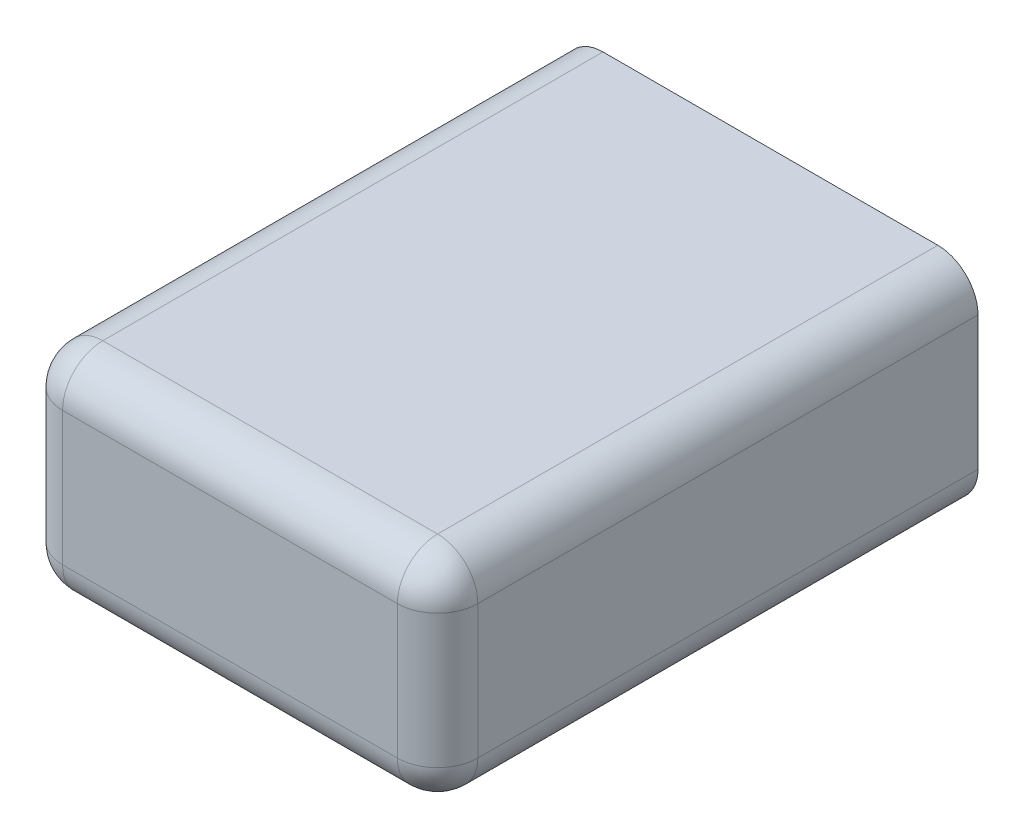
ISO-10303-21;
HEADER;
FILE_DESCRIPTION(('STEP AP214'),'2;1');
FILE_NAME('part.step','',(''),(''),'','','');
FILE_SCHEMA(('AUTOMOTIVE_DESIGN { 1 0 10303 214 1 1 1 1 }'));
ENDSEC;
DATA;
#1=APPLICATION_CONTEXT('core data for automotive mechanical design processes');
#2=APPLICATION_PROTOCOL_DEFINITION('international standard','automotive_design',2000,#1);
#3=PRODUCT_CONTEXT('',#1,'mechanical');
#4=PRODUCT('Part','Part','',(#3));
#5=PRODUCT_RELATED_PRODUCT_CATEGORY('part','',(#4));
#6=PRODUCT_DEFINITION_FORMATION('','',#4);
#7=PRODUCT_DEFINITION_CONTEXT('part definition',#1,'design');
#8=PRODUCT_DEFINITION('design','',#6,#7);
#9=PRODUCT_DEFINITION_SHAPE('','',#8);
#10=(LENGTH_UNIT() NAMED_UNIT(*) SI_UNIT(.MILLI.,.METRE.));
#11=(NAMED_UNIT(*) PLANE_ANGLE_UNIT() SI_UNIT($,.RADIAN.));
#12=(NAMED_UNIT(*) SI_UNIT($,.STERADIAN.) SOLID_ANGLE_UNIT());
#13=UNCERTAINTY_MEASURE_WITH_UNIT(LENGTH_MEASURE(1.E-05),#10,'distance_accuracy_value','');
#14=(GEOMETRIC_REPRESENTATION_CONTEXT(3) GLOBAL_UNCERTAINTY_ASSIGNED_CONTEXT((#13)) GLOBAL_UNIT_ASSIGNED_CONTEXT((#10,
#11,#12)) REPRESENTATION_CONTEXT('',''));
#15=CARTESIAN_POINT('',(0.,0.,0.));
#16=DIRECTION('',(0.,0.,1.));
#17=DIRECTION('',(1.,0.,0.));
#18=AXIS2_PLACEMENT_3D('',#15,#16,#17);
#19=CARTESIAN_POINT('',(0.,0.,0.));
#20=DIRECTION('',(0.,0.,1.));
#21=DIRECTION('',(1.,0.,0.));
#22=AXIS2_PLACEMENT_3D('',#19,#20,#21);
#23=PLANE('',#22);
#24=DIRECTION('',(1.,0.,0.));
#25=VECTOR('',#24,1.);
#26=CARTESIAN_POINT('',(7.,-4.26,0.));
#27=LINE('',#26,#25);
#28=CARTESIAN_POINT('',(-6.66,-4.26,0.));
#29=VERTEX_POINT('',#28);
#30=CARTESIAN_POINT('',(6.66,-4.26,0.));
#31=VERTEX_POINT('',#30);
#32=EDGE_CURVE('E211',#29,#31,#27,.T.);
#33=ORIENTED_EDGE('',*,*,#32,.F.);
#34=CARTESIAN_POINT('',(-6.66,-2.66,0.));
#35=DIRECTION('',(0.,0.,1.));
#36=DIRECTION('',(1.,0.,0.));
#37=AXIS2_PLACEMENT_3D('',#34,#35,#36);
#38=CIRCLE('',#37,1.6);
#39=CARTESIAN_POINT('',(-8.26,-2.66,0.));
#40=VERTEX_POINT('',#39);
#41=EDGE_CURVE('E195',#29,#40,#38,.F.);
#42=ORIENTED_EDGE('',*,*,#41,.T.);
#43=DIRECTION('',(0.,-1.,0.));
#44=VECTOR('',#43,1.);
#45=CARTESIAN_POINT('',(-8.26,-3.,0.));
#46=LINE('',#45,#44);
#47=CARTESIAN_POINT('',(-8.26,2.66,0.));
#48=VERTEX_POINT('',#47);
#49=EDGE_CURVE('E224',#48,#40,#46,.T.);
#50=ORIENTED_EDGE('',*,*,#49,.F.);
#51=CARTESIAN_POINT('',(-6.66,2.66,0.));
#52=DIRECTION('',(0.,0.,1.));
#53=DIRECTION('',(1.,0.,0.));
#54=AXIS2_PLACEMENT_3D('',#51,#52,#53);
#55=CIRCLE('',#54,1.6);
#56=CARTESIAN_POINT('',(-6.66,4.26,0.));
#57=VERTEX_POINT('',#56);
#58=EDGE_CURVE('E216',#48,#57,#55,.F.);
#59=ORIENTED_EDGE('',*,*,#58,.T.);
#60=DIRECTION('',(-1.,0.,0.));
#61=VECTOR('',#60,1.);
#62=CARTESIAN_POINT('',(7.,4.26,0.));
#63=LINE('',#62,#61);
#64=CARTESIAN_POINT('',(6.66,4.26,0.));
#65=VERTEX_POINT('',#64);
#66=EDGE_CURVE('E227',#65,#57,#63,.T.);
#67=ORIENTED_EDGE('',*,*,#66,.F.);
#68=CARTESIAN_POINT('',(6.66,2.66,0.));
#69=DIRECTION('',(0.,0.,1.));
#70=DIRECTION('',(1.,0.,0.));
#71=AXIS2_PLACEMENT_3D('',#68,#69,#70);
#72=CIRCLE('',#71,1.6);
#73=CARTESIAN_POINT('',(8.26,2.66,0.));
#74=VERTEX_POINT('',#73);
#75=EDGE_CURVE('E206',#65,#74,#72,.F.);
#76=ORIENTED_EDGE('',*,*,#75,.T.);
#77=DIRECTION('',(0.,1.,0.));
#78=VECTOR('',#77,1.);
#79=CARTESIAN_POINT('',(8.26,-3.,0.));
#80=LINE('',#79,#78);
#81=CARTESIAN_POINT('',(8.26,-2.66,0.));
#82=VERTEX_POINT('',#81);
#83=EDGE_CURVE('E223',#82,#74,#80,.T.);
#84=ORIENTED_EDGE('',*,*,#83,.F.);
#85=CARTESIAN_POINT('',(6.66,-2.66,0.));
#86=DIRECTION('',(0.,0.,1.));
#87=DIRECTION('',(1.,0.,0.));
#88=AXIS2_PLACEMENT_3D('',#85,#86,#87);
#89=CIRCLE('',#88,1.6);
#90=EDGE_CURVE('E222',#82,#31,#89,.F.);
#91=ORIENTED_EDGE('',*,*,#90,.T.);
#92=EDGE_LOOP('',(#33,#42,#50,#59,#67,#76,#84,#91));
#93=FACE_BOUND('',#92,.T.);
#94=DIRECTION('',(-1.,0.,0.));
#95=VECTOR('',#94,1.);
#96=CARTESIAN_POINT('',(7.,3.,0.));
#97=LINE('',#96,#95);
#98=CARTESIAN_POINT('',(6.5,3.,0.));
#99=VERTEX_POINT('',#98);
#100=CARTESIAN_POINT('',(-6.5,3.,0.));
#101=VERTEX_POINT('',#100);
#102=EDGE_CURVE('E229',#99,#101,#97,.T.);
#103=ORIENTED_EDGE('',*,*,#102,.T.);
#104=CARTESIAN_POINT('',(-6.5,2.5,0.));
#105=DIRECTION('',(0.,0.,1.));
#106=DIRECTION('',(1.,0.,0.));
#107=AXIS2_PLACEMENT_3D('',#104,#105,#106);
#108=CIRCLE('',#107,0.5);
#109=CARTESIAN_POINT('',(-7.,2.5,0.));
#110=VERTEX_POINT('',#109);
#111=EDGE_CURVE('E332',#101,#110,#108,.T.);
#112=ORIENTED_EDGE('',*,*,#111,.T.);
#113=DIRECTION('',(0.,-1.,0.));
#114=VECTOR('',#113,1.);
#115=CARTESIAN_POINT('',(-7.,-3.,0.));
#116=LINE('',#115,#114);
#117=CARTESIAN_POINT('',(-7.,-2.5,0.));
#118=VERTEX_POINT('',#117);
#119=EDGE_CURVE('E300',#110,#118,#116,.T.);
#120=ORIENTED_EDGE('',*,*,#119,.T.);
#121=CARTESIAN_POINT('',(-6.5,-2.5,0.));
#122=DIRECTION('',(0.,0.,1.));
#123=DIRECTION('',(1.,0.,0.));
#124=AXIS2_PLACEMENT_3D('',#121,#122,#123);
#125=CIRCLE('',#124,0.5);
#126=CARTESIAN_POINT('',(-6.5,-3.,0.));
#127=VERTEX_POINT('',#126);
#128=EDGE_CURVE('E334',#118,#127,#125,.T.);
#129=ORIENTED_EDGE('',*,*,#128,.T.);
#130=DIRECTION('',(1.,0.,0.));
#131=VECTOR('',#130,1.);
#132=CARTESIAN_POINT('',(7.,-3.,0.));
#133=LINE('',#132,#131);
#134=CARTESIAN_POINT('',(6.5,-3.,0.));
#135=VERTEX_POINT('',#134);
#136=EDGE_CURVE('E382',#127,#135,#133,.T.);
#137=ORIENTED_EDGE('',*,*,#136,.T.);
#138=CARTESIAN_POINT('',(6.5,-2.5,0.));
#139=DIRECTION('',(0.,0.,1.));
#140=DIRECTION('',(1.,0.,0.));
#141=AXIS2_PLACEMENT_3D('',#138,#139,#140);
#142=CIRCLE('',#141,0.5);
#143=CARTESIAN_POINT('',(7.,-2.5,0.));
#144=VERTEX_POINT('',#143);
#145=EDGE_CURVE('E66',#135,#144,#142,.T.);
#146=ORIENTED_EDGE('',*,*,#145,.T.);
#147=DIRECTION('',(0.,1.,0.));
#148=VECTOR('',#147,1.);
#149=CARTESIAN_POINT('',(7.,-3.,0.));
#150=LINE('',#149,#148);
#151=CARTESIAN_POINT('',(7.,2.5,0.));
#152=VERTEX_POINT('',#151);
#153=EDGE_CURVE('E388',#144,#152,#150,.T.);
#154=ORIENTED_EDGE('',*,*,#153,.T.);
#155=CARTESIAN_POINT('',(6.5,2.5,0.));
#156=DIRECTION('',(0.,0.,1.));
#157=DIRECTION('',(1.,0.,0.));
#158=AXIS2_PLACEMENT_3D('',#155,#156,#157);
#159=CIRCLE('',#158,0.5);
#160=EDGE_CURVE('E12',#152,#99,#159,.T.);
#161=ORIENTED_EDGE('',*,*,#160,.T.);
#162=EDGE_LOOP('',(#103,#112,#120,#129,#137,#146,#154,#161));
#163=FACE_BOUND('',#162,.T.);
#164=ADVANCED_FACE('F57',(#93,#163),#23,.F.);
#165=CARTESIAN_POINT('',(-8.26,-3.,20.));
#166=DIRECTION('',(1.,0.,0.));
#167=DIRECTION('',(0.,0.,-1.));
#168=AXIS2_PLACEMENT_3D('',#165,#166,#167);
#169=PLANE('',#168);
#170=ORIENTED_EDGE('',*,*,#49,.T.);
#171=DIRECTION('',(0.,0.,-1.));
#172=VECTOR('',#171,1.);
#173=CARTESIAN_POINT('',(-8.26,-2.66,20.));
#174=LINE('',#173,#172);
#175=CARTESIAN_POINT('',(-8.26,-2.66,19.9));
#176=VERTEX_POINT('',#175);
#177=EDGE_CURVE('E200',#40,#176,#174,.F.);
#178=ORIENTED_EDGE('',*,*,#177,.T.);
#179=DIRECTION('',(0.,-1.,0.));
#180=VECTOR('',#179,1.);
#181=CARTESIAN_POINT('',(-8.26,4.26,19.9));
#182=LINE('',#181,#180);
#183=CARTESIAN_POINT('',(-8.26,2.66,19.9));
#184=VERTEX_POINT('',#183);
#185=EDGE_CURVE('E241',#176,#184,#182,.F.);
#186=ORIENTED_EDGE('',*,*,#185,.T.);
#187=DIRECTION('',(0.,0.,-1.));
#188=VECTOR('',#187,1.);
#189=CARTESIAN_POINT('',(-8.26,2.66,20.));
#190=LINE('',#189,#188);
#191=EDGE_CURVE('E205',#184,#48,#190,.T.);
#192=ORIENTED_EDGE('',*,*,#191,.T.);
#193=EDGE_LOOP('',(#170,#178,#186,#192));
#194=FACE_BOUND('',#193,.T.);
#195=ADVANCED_FACE('F447',(#194),#169,.F.);
#196=CARTESIAN_POINT('',(7.,-4.26,20.));
#197=DIRECTION('',(0.,1.,0.));
#198=DIRECTION('',(-1.,0.,0.));
#199=AXIS2_PLACEMENT_3D('',#196,#197,#198);
#200=PLANE('',#199);
#201=DIRECTION('',(1.,0.,0.));
#202=VECTOR('',#201,1.);
#203=CARTESIAN_POINT('',(-8.26,-4.26,19.9));
#204=LINE('',#203,#202);
#205=CARTESIAN_POINT('',(6.66,-4.26,19.9));
#206=VERTEX_POINT('',#205);
#207=CARTESIAN_POINT('',(-6.66,-4.26,19.9));
#208=VERTEX_POINT('',#207);
#209=EDGE_CURVE('E214',#206,#208,#204,.F.);
#210=ORIENTED_EDGE('',*,*,#209,.T.);
#211=DIRECTION('',(0.,0.,-1.));
#212=VECTOR('',#211,1.);
#213=CARTESIAN_POINT('',(-6.66,-4.26,20.));
#214=LINE('',#213,#212);
#215=EDGE_CURVE('E199',#208,#29,#214,.T.);
#216=ORIENTED_EDGE('',*,*,#215,.T.);
#217=ORIENTED_EDGE('',*,*,#32,.T.);
#218=DIRECTION('',(0.,0.,-1.));
#219=VECTOR('',#218,1.);
#220=CARTESIAN_POINT('',(6.66,-4.26,20.));
#221=LINE('',#220,#219);
#222=EDGE_CURVE('E217',#31,#206,#221,.F.);
#223=ORIENTED_EDGE('',*,*,#222,.T.);
#224=EDGE_LOOP('',(#210,#216,#217,#223));
#225=FACE_BOUND('',#224,.T.);
#226=ADVANCED_FACE('F210',(#225),#200,.F.);
#227=CARTESIAN_POINT('',(8.26,-3.,20.));
#228=DIRECTION('',(-1.,0.,0.));
#229=DIRECTION('',(0.,0.,1.));
#230=AXIS2_PLACEMENT_3D('',#227,#228,#229);
#231=PLANE('',#230);
#232=ORIENTED_EDGE('',*,*,#83,.T.);
#233=DIRECTION('',(0.,0.,-1.));
#234=VECTOR('',#233,1.);
#235=CARTESIAN_POINT('',(8.26,2.66,20.));
#236=LINE('',#235,#234);
#237=CARTESIAN_POINT('',(8.26,2.66,19.9));
#238=VERTEX_POINT('',#237);
#239=EDGE_CURVE('E254',#74,#238,#236,.F.);
#240=ORIENTED_EDGE('',*,*,#239,.T.);
#241=DIRECTION('',(0.,1.,0.));
#242=VECTOR('',#241,1.);
#243=CARTESIAN_POINT('',(8.26,-4.26,19.9));
#244=LINE('',#243,#242);
#245=CARTESIAN_POINT('',(8.26,-2.66,19.9));
#246=VERTEX_POINT('',#245);
#247=EDGE_CURVE('E250',#238,#246,#244,.F.);
#248=ORIENTED_EDGE('',*,*,#247,.T.);
#249=DIRECTION('',(0.,0.,-1.));
#250=VECTOR('',#249,1.);
#251=CARTESIAN_POINT('',(8.26,-2.66,20.));
#252=LINE('',#251,#250);
#253=EDGE_CURVE('E252',#246,#82,#252,.T.);
#254=ORIENTED_EDGE('',*,*,#253,.T.);
#255=EDGE_LOOP('',(#232,#240,#248,#254));
#256=FACE_BOUND('',#255,.T.);
#257=ADVANCED_FACE('F460',(#256),#231,.F.);
#258=CARTESIAN_POINT('',(7.,4.26,20.));
#259=DIRECTION('',(0.,-1.,0.));
#260=DIRECTION('',(1.,0.,0.));
#261=AXIS2_PLACEMENT_3D('',#258,#259,#260);
#262=PLANE('',#261);
#263=DIRECTION('',(-1.,0.,0.));
#264=VECTOR('',#263,1.);
#265=CARTESIAN_POINT('',(8.26,4.26,19.9));
#266=LINE('',#265,#264);
#267=CARTESIAN_POINT('',(-6.66,4.26,19.9));
#268=VERTEX_POINT('',#267);
#269=CARTESIAN_POINT('',(6.66,4.26,19.9));
#270=VERTEX_POINT('',#269);
#271=EDGE_CURVE('E246',#268,#270,#266,.F.);
#272=ORIENTED_EDGE('',*,*,#271,.T.);
#273=DIRECTION('',(0.,0.,-1.));
#274=VECTOR('',#273,1.);
#275=CARTESIAN_POINT('',(6.66,4.26,20.));
#276=LINE('',#275,#274);
#277=EDGE_CURVE('E248',#270,#65,#276,.T.);
#278=ORIENTED_EDGE('',*,*,#277,.T.);
#279=ORIENTED_EDGE('',*,*,#66,.T.);
#280=DIRECTION('',(0.,0.,-1.));
#281=VECTOR('',#280,1.);
#282=CARTESIAN_POINT('',(-6.66,4.26,20.));
#283=LINE('',#282,#281);
#284=EDGE_CURVE('E244',#57,#268,#283,.F.);
#285=ORIENTED_EDGE('',*,*,#284,.T.);
#286=EDGE_LOOP('',(#272,#278,#279,#285));
#287=FACE_BOUND('',#286,.T.);
#288=ADVANCED_FACE('F457',(#287),#262,.F.);
#289=CARTESIAN_POINT('',(-7.,-3.,20.));
#290=DIRECTION('',(1.,0.,0.));
#291=DIRECTION('',(0.,0.,-1.));
#292=AXIS2_PLACEMENT_3D('',#289,#290,#291);
#293=PLANE('',#292);
#294=ORIENTED_EDGE('',*,*,#119,.F.);
#295=DIRECTION('',(0.,0.,-1.));
#296=VECTOR('',#295,1.);
#297=CARTESIAN_POINT('',(-7.,2.5,20.));
#298=LINE('',#297,#296);
#299=CARTESIAN_POINT('',(-7.,2.5,19.5));
#300=VERTEX_POINT('',#299);
#301=EDGE_CURVE('E311',#110,#300,#298,.F.);
#302=ORIENTED_EDGE('',*,*,#301,.T.);
#303=DIRECTION('',(0.,-1.,0.));
#304=VECTOR('',#303,1.);
#305=CARTESIAN_POINT('',(-7.,-3.,19.5));
#306=LINE('',#305,#304);
#307=CARTESIAN_POINT('',(-7.,-2.5,19.5));
#308=VERTEX_POINT('',#307);
#309=EDGE_CURVE('E307',#300,#308,#306,.T.);
#310=ORIENTED_EDGE('',*,*,#309,.T.);
#311=DIRECTION('',(0.,0.,-1.));
#312=VECTOR('',#311,1.);
#313=CARTESIAN_POINT('',(-7.,-2.5,0.));
#314=LINE('',#313,#312);
#315=EDGE_CURVE('E309',#308,#118,#314,.T.);
#316=ORIENTED_EDGE('',*,*,#315,.T.);
#317=EDGE_LOOP('',(#294,#302,#310,#316));
#318=FACE_BOUND('',#317,.T.);
#319=ADVANCED_FACE('F420',(#318),#293,.T.);
#320=CARTESIAN_POINT('',(7.,-3.,20.));
#321=DIRECTION('',(0.,1.,0.));
#322=DIRECTION('',(-1.,0.,0.));
#323=AXIS2_PLACEMENT_3D('',#320,#321,#322);
#324=PLANE('',#323);
#325=ORIENTED_EDGE('',*,*,#136,.F.);
#326=DIRECTION('',(0.,0.,-1.));
#327=VECTOR('',#326,1.);
#328=CARTESIAN_POINT('',(-6.5,-3.,20.));
#329=LINE('',#328,#327);
#330=CARTESIAN_POINT('',(-6.5,-3.,19.5));
#331=VERTEX_POINT('',#330);
#332=EDGE_CURVE('E317',#127,#331,#329,.F.);
#333=ORIENTED_EDGE('',*,*,#332,.T.);
#334=DIRECTION('',(1.,0.,0.));
#335=VECTOR('',#334,1.);
#336=CARTESIAN_POINT('',(7.,-3.,19.5));
#337=LINE('',#336,#335);
#338=CARTESIAN_POINT('',(6.5,-3.,19.5));
#339=VERTEX_POINT('',#338);
#340=EDGE_CURVE('E315',#331,#339,#337,.T.);
#341=ORIENTED_EDGE('',*,*,#340,.T.);
#342=DIRECTION('',(0.,0.,-1.));
#343=VECTOR('',#342,1.);
#344=CARTESIAN_POINT('',(6.5,-3.,0.));
#345=LINE('',#344,#343);
#346=EDGE_CURVE('E313',#339,#135,#345,.T.);
#347=ORIENTED_EDGE('',*,*,#346,.T.);
#348=EDGE_LOOP('',(#325,#333,#341,#347));
#349=FACE_BOUND('',#348,.T.);
#350=ADVANCED_FACE('F381',(#349),#324,.T.);
#351=CARTESIAN_POINT('',(7.,-3.,20.));
#352=DIRECTION('',(-1.,0.,0.));
#353=DIRECTION('',(0.,0.,1.));
#354=AXIS2_PLACEMENT_3D('',#351,#352,#353);
#355=PLANE('',#354);
#356=ORIENTED_EDGE('',*,*,#153,.F.);
#357=DIRECTION('',(0.,0.,-1.));
#358=VECTOR('',#357,1.);
#359=CARTESIAN_POINT('',(7.,-2.5,20.));
#360=LINE('',#359,#358);
#361=CARTESIAN_POINT('',(7.,-2.5,19.5));
#362=VERTEX_POINT('',#361);
#363=EDGE_CURVE('E74',#144,#362,#360,.F.);
#364=ORIENTED_EDGE('',*,*,#363,.T.);
#365=DIRECTION('',(0.,1.,0.));
#366=VECTOR('',#365,1.);
#367=CARTESIAN_POINT('',(7.,-3.,19.5));
#368=LINE('',#367,#366);
#369=CARTESIAN_POINT('',(7.,2.5,19.5));
#370=VERTEX_POINT('',#369);
#371=EDGE_CURVE('E79',#362,#370,#368,.T.);
#372=ORIENTED_EDGE('',*,*,#371,.T.);
#373=DIRECTION('',(0.,0.,-1.));
#374=VECTOR('',#373,1.);
#375=CARTESIAN_POINT('',(7.,2.5,0.));
#376=LINE('',#375,#374);
#377=EDGE_CURVE('E328',#370,#152,#376,.T.);
#378=ORIENTED_EDGE('',*,*,#377,.T.);
#379=EDGE_LOOP('',(#356,#364,#372,#378));
#380=FACE_BOUND('',#379,.T.);
#381=ADVANCED_FACE('F710',(#380),#355,.T.);
#382=CARTESIAN_POINT('',(7.,3.,20.));
#383=DIRECTION('',(0.,-1.,0.));
#384=DIRECTION('',(1.,0.,0.));
#385=AXIS2_PLACEMENT_3D('',#382,#383,#384);
#386=PLANE('',#385);
#387=DIRECTION('',(-1.,0.,0.));
#388=VECTOR('',#387,1.);
#389=CARTESIAN_POINT('',(7.,3.,19.5));
#390=LINE('',#389,#388);
#391=CARTESIAN_POINT('',(6.5,3.,19.5));
#392=VERTEX_POINT('',#391);
#393=CARTESIAN_POINT('',(-6.5,3.,19.5));
#394=VERTEX_POINT('',#393);
#395=EDGE_CURVE('E302',#392,#394,#390,.T.);
#396=ORIENTED_EDGE('',*,*,#395,.T.);
#397=DIRECTION('',(0.,0.,-1.));
#398=VECTOR('',#397,1.);
#399=CARTESIAN_POINT('',(-6.5,3.,0.));
#400=LINE('',#399,#398);
#401=EDGE_CURVE('E304',#394,#101,#400,.T.);
#402=ORIENTED_EDGE('',*,*,#401,.T.);
#403=ORIENTED_EDGE('',*,*,#102,.F.);
#404=DIRECTION('',(0.,0.,-1.));
#405=VECTOR('',#404,1.);
#406=CARTESIAN_POINT('',(6.5,3.,20.));
#407=LINE('',#406,#405);
#408=EDGE_CURVE('E265',#99,#392,#407,.F.);
#409=ORIENTED_EDGE('',*,*,#408,.T.);
#410=EDGE_LOOP('',(#396,#402,#403,#409));
#411=FACE_BOUND('',#410,.T.);
#412=ADVANCED_FACE('F397',(#411),#386,.T.);
#413=CARTESIAN_POINT('',(0.,0.,20.));
#414=DIRECTION('',(0.,0.,1.));
#415=DIRECTION('',(1.,0.,0.));
#416=AXIS2_PLACEMENT_3D('',#413,#414,#415);
#417=PLANE('',#416);
#418=DIRECTION('',(1.,0.,0.));
#419=VECTOR('',#418,1.);
#420=CARTESIAN_POINT('',(0.,-2.5,20.));
#421=LINE('',#420,#419);
#422=CARTESIAN_POINT('',(6.5,-2.5,20.));
#423=VERTEX_POINT('',#422);
#424=CARTESIAN_POINT('',(-6.5,-2.5,20.));
#425=VERTEX_POINT('',#424);
#426=EDGE_CURVE('E323',#423,#425,#421,.F.);
#427=ORIENTED_EDGE('',*,*,#426,.T.);
#428=DIRECTION('',(0.,-1.,0.));
#429=VECTOR('',#428,1.);
#430=CARTESIAN_POINT('',(-6.5,0.,20.));
#431=LINE('',#430,#429);
#432=CARTESIAN_POINT('',(-6.5,2.5,20.));
#433=VERTEX_POINT('',#432);
#434=EDGE_CURVE('E325',#425,#433,#431,.F.);
#435=ORIENTED_EDGE('',*,*,#434,.T.);
#436=DIRECTION('',(-1.,0.,0.));
#437=VECTOR('',#436,1.);
#438=CARTESIAN_POINT('',(0.,2.5,20.));
#439=LINE('',#438,#437);
#440=CARTESIAN_POINT('',(6.5,2.5,20.));
#441=VERTEX_POINT('',#440);
#442=EDGE_CURVE('E319',#433,#441,#439,.F.);
#443=ORIENTED_EDGE('',*,*,#442,.T.);
#444=DIRECTION('',(0.,1.,0.));
#445=VECTOR('',#444,1.);
#446=CARTESIAN_POINT('',(6.5,0.,20.));
#447=LINE('',#446,#445);
#448=EDGE_CURVE('E321',#441,#423,#447,.F.);
#449=ORIENTED_EDGE('',*,*,#448,.T.);
#450=EDGE_LOOP('',(#427,#435,#443,#449));
#451=FACE_BOUND('',#450,.T.);
#452=ADVANCED_FACE('F434',(#451),#417,.F.);
#453=CARTESIAN_POINT('',(0.,0.,21.5));
#454=DIRECTION('',(0.,0.,1.));
#455=DIRECTION('',(1.,0.,0.));
#456=AXIS2_PLACEMENT_3D('',#453,#454,#455);
#457=PLANE('',#456);
#458=DIRECTION('',(0.,-1.,0.));
#459=VECTOR('',#458,1.);
#460=CARTESIAN_POINT('',(-6.66,-4.26,21.5));
#461=LINE('',#460,#459);
#462=CARTESIAN_POINT('',(-6.66,2.66,21.5));
#463=VERTEX_POINT('',#462);
#464=CARTESIAN_POINT('',(-6.66,-2.66,21.5));
#465=VERTEX_POINT('',#464);
#466=EDGE_CURVE('E256',#463,#465,#461,.T.);
#467=ORIENTED_EDGE('',*,*,#466,.T.);
#468=DIRECTION('',(1.,0.,0.));
#469=VECTOR('',#468,1.);
#470=CARTESIAN_POINT('',(8.26,-2.66,21.5));
#471=LINE('',#470,#469);
#472=CARTESIAN_POINT('',(6.66,-2.66,21.5));
#473=VERTEX_POINT('',#472);
#474=EDGE_CURVE('E262',#465,#473,#471,.T.);
#475=ORIENTED_EDGE('',*,*,#474,.T.);
#476=DIRECTION('',(0.,1.,0.));
#477=VECTOR('',#476,1.);
#478=CARTESIAN_POINT('',(6.66,4.26,21.5));
#479=LINE('',#478,#477);
#480=CARTESIAN_POINT('',(6.66,2.66,21.5));
#481=VERTEX_POINT('',#480);
#482=EDGE_CURVE('E260',#473,#481,#479,.T.);
#483=ORIENTED_EDGE('',*,*,#482,.T.);
#484=DIRECTION('',(-1.,0.,0.));
#485=VECTOR('',#484,1.);
#486=CARTESIAN_POINT('',(-8.26,2.66,21.5));
#487=LINE('',#486,#485);
#488=EDGE_CURVE('E258',#481,#463,#487,.T.);
#489=ORIENTED_EDGE('',*,*,#488,.T.);
#490=EDGE_LOOP('',(#467,#475,#483,#489));
#491=FACE_BOUND('',#490,.T.);
#492=ADVANCED_FACE('F512',(#491),#457,.T.);
#493=CARTESIAN_POINT('',(6.66,2.66,20.));
#494=DIRECTION('',(0.,0.,-1.));
#495=DIRECTION('',(-1.,0.,0.));
#496=AXIS2_PLACEMENT_3D('',#493,#494,#495);
#497=CYLINDRICAL_SURFACE('',#496,1.6);
#498=CARTESIAN_POINT('',(6.66,2.66,19.9));
#499=DIRECTION('',(0.,0.,1.));
#500=DIRECTION('',(1.,0.,0.));
#501=AXIS2_PLACEMENT_3D('',#498,#499,#500);
#502=CIRCLE('',#501,1.6);
#503=EDGE_CURVE('E297',#238,#270,#502,.T.);
#504=ORIENTED_EDGE('',*,*,#503,.F.);
#505=ORIENTED_EDGE('',*,*,#239,.F.);
#506=ORIENTED_EDGE('',*,*,#75,.F.);
#507=ORIENTED_EDGE('',*,*,#277,.F.);
#508=EDGE_LOOP('',(#504,#505,#506,#507));
#509=FACE_BOUND('',#508,.T.);
#510=ADVANCED_FACE('F508',(#509),#497,.T.);
#511=CARTESIAN_POINT('',(6.66,2.66,19.9));
#512=DIRECTION('',(0.,0.,1.));
#513=DIRECTION('',(1.,0.,0.));
#514=AXIS2_PLACEMENT_3D('',#511,#512,#513);
#515=SPHERICAL_SURFACE('',#514,1.6);
#516=CARTESIAN_POINT('',(6.66,2.66,19.9));
#517=DIRECTION('',(0.,1.,0.));
#518=DIRECTION('',(0.,0.,1.));
#519=AXIS2_PLACEMENT_3D('',#516,#517,#518);
#520=CIRCLE('',#519,1.6);
#521=EDGE_CURVE('E291',#238,#481,#520,.F.);
#522=ORIENTED_EDGE('',*,*,#521,.F.);
#523=ORIENTED_EDGE('',*,*,#503,.T.);
#524=CARTESIAN_POINT('',(6.66,2.66,19.9));
#525=DIRECTION('',(1.,0.,0.));
#526=DIRECTION('',(0.,0.,-1.));
#527=AXIS2_PLACEMENT_3D('',#524,#525,#526);
#528=CIRCLE('',#527,1.6);
#529=EDGE_CURVE('E294',#481,#270,#528,.F.);
#530=ORIENTED_EDGE('',*,*,#529,.F.);
#531=EDGE_LOOP('',(#522,#523,#530));
#532=FACE_BOUND('',#531,.T.);
#533=ADVANCED_FACE('F504',(#532),#515,.T.);
#534=CARTESIAN_POINT('',(-6.66,2.66,20.));
#535=DIRECTION('',(0.,0.,-1.));
#536=DIRECTION('',(-1.,0.,0.));
#537=AXIS2_PLACEMENT_3D('',#534,#535,#536);
#538=CYLINDRICAL_SURFACE('',#537,1.6);
#539=ORIENTED_EDGE('',*,*,#58,.F.);
#540=ORIENTED_EDGE('',*,*,#191,.F.);
#541=CARTESIAN_POINT('',(-6.66,2.66,19.9));
#542=DIRECTION('',(0.,0.,1.));
#543=DIRECTION('',(1.,0.,0.));
#544=AXIS2_PLACEMENT_3D('',#541,#542,#543);
#545=CIRCLE('',#544,1.6);
#546=EDGE_CURVE('E288',#268,#184,#545,.T.);
#547=ORIENTED_EDGE('',*,*,#546,.F.);
#548=ORIENTED_EDGE('',*,*,#284,.F.);
#549=EDGE_LOOP('',(#539,#540,#547,#548));
#550=FACE_BOUND('',#549,.T.);
#551=ADVANCED_FACE('F500',(#550),#538,.T.);
#552=CARTESIAN_POINT('',(0.,2.66,19.9));
#553=DIRECTION('',(1.,0.,0.));
#554=DIRECTION('',(0.,1.,0.));
#555=AXIS2_PLACEMENT_3D('',#552,#553,#554);
#556=CYLINDRICAL_SURFACE('',#555,1.6);
#557=ORIENTED_EDGE('',*,*,#529,.T.);
#558=ORIENTED_EDGE('',*,*,#271,.F.);
#559=CARTESIAN_POINT('',(-6.66,2.66,19.9));
#560=DIRECTION('',(-1.,0.,0.));
#561=DIRECTION('',(0.,0.,1.));
#562=AXIS2_PLACEMENT_3D('',#559,#560,#561);
#563=CIRCLE('',#562,1.6);
#564=EDGE_CURVE('E285',#463,#268,#563,.T.);
#565=ORIENTED_EDGE('',*,*,#564,.F.);
#566=ORIENTED_EDGE('',*,*,#488,.F.);
#567=EDGE_LOOP('',(#557,#558,#565,#566));
#568=FACE_BOUND('',#567,.T.);
#569=ADVANCED_FACE('F496',(#568),#556,.T.);
#570=CARTESIAN_POINT('',(6.66,0.,19.9));
#571=DIRECTION('',(0.,-1.,0.));
#572=DIRECTION('',(0.,0.,-1.));
#573=AXIS2_PLACEMENT_3D('',#570,#571,#572);
#574=CYLINDRICAL_SURFACE('',#573,1.6);
#575=ORIENTED_EDGE('',*,*,#521,.T.);
#576=ORIENTED_EDGE('',*,*,#482,.F.);
#577=CARTESIAN_POINT('',(6.66,-2.66,19.9));
#578=DIRECTION('',(0.,-1.,0.));
#579=DIRECTION('',(0.,0.,-1.));
#580=AXIS2_PLACEMENT_3D('',#577,#578,#579);
#581=CIRCLE('',#580,1.6);
#582=EDGE_CURVE('E282',#246,#473,#581,.T.);
#583=ORIENTED_EDGE('',*,*,#582,.F.);
#584=ORIENTED_EDGE('',*,*,#247,.F.);
#585=EDGE_LOOP('',(#575,#576,#583,#584));
#586=FACE_BOUND('',#585,.T.);
#587=ADVANCED_FACE('F492',(#586),#574,.T.);
#588=CARTESIAN_POINT('',(6.66,-2.66,20.));
#589=DIRECTION('',(0.,0.,-1.));
#590=DIRECTION('',(-1.,0.,0.));
#591=AXIS2_PLACEMENT_3D('',#588,#589,#590);
#592=CYLINDRICAL_SURFACE('',#591,1.6);
#593=ORIENTED_EDGE('',*,*,#90,.F.);
#594=ORIENTED_EDGE('',*,*,#253,.F.);
#595=CARTESIAN_POINT('',(6.66,-2.66,19.9));
#596=DIRECTION('',(0.,0.,1.));
#597=DIRECTION('',(1.,0.,0.));
#598=AXIS2_PLACEMENT_3D('',#595,#596,#597);
#599=CIRCLE('',#598,1.6);
#600=EDGE_CURVE('E279',#206,#246,#599,.T.);
#601=ORIENTED_EDGE('',*,*,#600,.F.);
#602=ORIENTED_EDGE('',*,*,#222,.F.);
#603=EDGE_LOOP('',(#593,#594,#601,#602));
#604=FACE_BOUND('',#603,.T.);
#605=ADVANCED_FACE('F488',(#604),#592,.T.);
#606=CARTESIAN_POINT('',(-6.66,2.66,19.9));
#607=DIRECTION('',(0.,0.,1.));
#608=DIRECTION('',(1.,0.,0.));
#609=AXIS2_PLACEMENT_3D('',#606,#607,#608);
#610=SPHERICAL_SURFACE('',#609,1.6);
#611=ORIENTED_EDGE('',*,*,#564,.T.);
#612=ORIENTED_EDGE('',*,*,#546,.T.);
#613=CARTESIAN_POINT('',(-6.66,2.66,19.9));
#614=DIRECTION('',(0.,1.,0.));
#615=DIRECTION('',(0.,0.,1.));
#616=AXIS2_PLACEMENT_3D('',#613,#614,#615);
#617=CIRCLE('',#616,1.6);
#618=EDGE_CURVE('E276',#463,#184,#617,.F.);
#619=ORIENTED_EDGE('',*,*,#618,.F.);
#620=EDGE_LOOP('',(#611,#612,#619));
#621=FACE_BOUND('',#620,.T.);
#622=ADVANCED_FACE('F484',(#621),#610,.T.);
#623=CARTESIAN_POINT('',(6.66,-2.66,19.9));
#624=DIRECTION('',(0.,0.,1.));
#625=DIRECTION('',(1.,0.,0.));
#626=AXIS2_PLACEMENT_3D('',#623,#624,#625);
#627=SPHERICAL_SURFACE('',#626,1.6);
#628=ORIENTED_EDGE('',*,*,#600,.T.);
#629=ORIENTED_EDGE('',*,*,#582,.T.);
#630=CARTESIAN_POINT('',(6.66,-2.66,19.9));
#631=DIRECTION('',(1.,0.,0.));
#632=DIRECTION('',(0.,0.,-1.));
#633=AXIS2_PLACEMENT_3D('',#630,#631,#632);
#634=CIRCLE('',#633,1.6);
#635=EDGE_CURVE('E274',#206,#473,#634,.F.);
#636=ORIENTED_EDGE('',*,*,#635,.F.);
#637=EDGE_LOOP('',(#628,#629,#636));
#638=FACE_BOUND('',#637,.T.);
#639=ADVANCED_FACE('F480',(#638),#627,.T.);
#640=CARTESIAN_POINT('',(-6.66,0.,19.9));
#641=DIRECTION('',(0.,1.,0.));
#642=DIRECTION('',(0.,0.,1.));
#643=AXIS2_PLACEMENT_3D('',#640,#641,#642);
#644=CYLINDRICAL_SURFACE('',#643,1.6);
#645=ORIENTED_EDGE('',*,*,#618,.T.);
#646=ORIENTED_EDGE('',*,*,#185,.F.);
#647=CARTESIAN_POINT('',(-6.66,-2.66,19.9));
#648=DIRECTION('',(0.,-1.,0.));
#649=DIRECTION('',(0.,0.,-1.));
#650=AXIS2_PLACEMENT_3D('',#647,#648,#649);
#651=CIRCLE('',#650,1.6);
#652=EDGE_CURVE('E271',#465,#176,#651,.T.);
#653=ORIENTED_EDGE('',*,*,#652,.F.);
#654=ORIENTED_EDGE('',*,*,#466,.F.);
#655=EDGE_LOOP('',(#645,#646,#653,#654));
#656=FACE_BOUND('',#655,.T.);
#657=ADVANCED_FACE('F476',(#656),#644,.T.);
#658=CARTESIAN_POINT('',(0.,-2.66,19.9));
#659=DIRECTION('',(-1.,0.,0.));
#660=DIRECTION('',(0.,-1.,0.));
#661=AXIS2_PLACEMENT_3D('',#658,#659,#660);
#662=CYLINDRICAL_SURFACE('',#661,1.6);
#663=ORIENTED_EDGE('',*,*,#635,.T.);
#664=ORIENTED_EDGE('',*,*,#474,.F.);
#665=CARTESIAN_POINT('',(-6.66,-2.66,19.9));
#666=DIRECTION('',(-1.,0.,0.));
#667=DIRECTION('',(0.,0.,1.));
#668=AXIS2_PLACEMENT_3D('',#665,#666,#667);
#669=CIRCLE('',#668,1.6);
#670=EDGE_CURVE('E268',#208,#465,#669,.T.);
#671=ORIENTED_EDGE('',*,*,#670,.F.);
#672=ORIENTED_EDGE('',*,*,#209,.F.);
#673=EDGE_LOOP('',(#663,#664,#671,#672));
#674=FACE_BOUND('',#673,.T.);
#675=ADVANCED_FACE('F472',(#674),#662,.T.);
#676=CARTESIAN_POINT('',(-6.66,-2.66,19.9));
#677=DIRECTION('',(0.,0.,1.));
#678=DIRECTION('',(1.,0.,0.));
#679=AXIS2_PLACEMENT_3D('',#676,#677,#678);
#680=SPHERICAL_SURFACE('',#679,1.6);
#681=ORIENTED_EDGE('',*,*,#670,.T.);
#682=ORIENTED_EDGE('',*,*,#652,.T.);
#683=CARTESIAN_POINT('',(-6.66,-2.66,19.9));
#684=DIRECTION('',(0.,0.,1.));
#685=DIRECTION('',(1.,0.,0.));
#686=AXIS2_PLACEMENT_3D('',#683,#684,#685);
#687=CIRCLE('',#686,1.6);
#688=EDGE_CURVE('E266',#208,#176,#687,.F.);
#689=ORIENTED_EDGE('',*,*,#688,.F.);
#690=EDGE_LOOP('',(#681,#682,#689));
#691=FACE_BOUND('',#690,.T.);
#692=ADVANCED_FACE('F469',(#691),#680,.T.);
#693=CARTESIAN_POINT('',(-6.66,-2.66,20.));
#694=DIRECTION('',(0.,0.,-1.));
#695=DIRECTION('',(-1.,0.,0.));
#696=AXIS2_PLACEMENT_3D('',#693,#694,#695);
#697=CYLINDRICAL_SURFACE('',#696,1.6);
#698=ORIENTED_EDGE('',*,*,#688,.T.);
#699=ORIENTED_EDGE('',*,*,#177,.F.);
#700=ORIENTED_EDGE('',*,*,#41,.F.);
#701=ORIENTED_EDGE('',*,*,#215,.F.);
#702=EDGE_LOOP('',(#698,#699,#700,#701));
#703=FACE_BOUND('',#702,.T.);
#704=ADVANCED_FACE('F198',(#703),#697,.T.);
#705=CARTESIAN_POINT('',(6.5,-2.5,20.));
#706=DIRECTION('',(0.,0.,1.));
#707=DIRECTION('',(1.,0.,0.));
#708=AXIS2_PLACEMENT_3D('',#705,#706,#707);
#709=CYLINDRICAL_SURFACE('',#708,0.5);
#710=CARTESIAN_POINT('',(6.5,-2.5,19.5));
#711=DIRECTION('',(0.,0.,-1.));
#712=DIRECTION('',(-1.,0.,0.));
#713=AXIS2_PLACEMENT_3D('',#710,#711,#712);
#714=CIRCLE('',#713,0.5);
#715=EDGE_CURVE('E61',#362,#339,#714,.T.);
#716=ORIENTED_EDGE('',*,*,#715,.F.);
#717=ORIENTED_EDGE('',*,*,#363,.F.);
#718=ORIENTED_EDGE('',*,*,#145,.F.);
#719=ORIENTED_EDGE('',*,*,#346,.F.);
#720=EDGE_LOOP('',(#716,#717,#718,#719));
#721=FACE_BOUND('',#720,.T.);
#722=ADVANCED_FACE('F59',(#721),#709,.F.);
#723=CARTESIAN_POINT('',(6.5,-2.5,19.5));
#724=DIRECTION('',(0.,0.,1.));
#725=DIRECTION('',(1.,0.,0.));
#726=AXIS2_PLACEMENT_3D('',#723,#724,#725);
#727=SPHERICAL_SURFACE('',#726,0.5);
#728=CARTESIAN_POINT('',(6.5,-2.5,19.5));
#729=DIRECTION('',(0.,1.,0.));
#730=DIRECTION('',(0.,0.,1.));
#731=AXIS2_PLACEMENT_3D('',#728,#729,#730);
#732=CIRCLE('',#731,0.5);
#733=EDGE_CURVE('E363',#362,#423,#732,.F.);
#734=ORIENTED_EDGE('',*,*,#733,.F.);
#735=ORIENTED_EDGE('',*,*,#715,.T.);
#736=CARTESIAN_POINT('',(6.5,-2.5,19.5));
#737=DIRECTION('',(-1.,0.,0.));
#738=DIRECTION('',(0.,0.,1.));
#739=AXIS2_PLACEMENT_3D('',#736,#737,#738);
#740=CIRCLE('',#739,0.5);
#741=EDGE_CURVE('E365',#423,#339,#740,.F.);
#742=ORIENTED_EDGE('',*,*,#741,.F.);
#743=EDGE_LOOP('',(#734,#735,#742));
#744=FACE_BOUND('',#743,.T.);
#745=ADVANCED_FACE('F374',(#744),#727,.F.);
#746=CARTESIAN_POINT('',(-6.5,-2.5,20.));
#747=DIRECTION('',(0.,0.,1.));
#748=DIRECTION('',(1.,0.,0.));
#749=AXIS2_PLACEMENT_3D('',#746,#747,#748);
#750=CYLINDRICAL_SURFACE('',#749,0.5);
#751=ORIENTED_EDGE('',*,*,#128,.F.);
#752=ORIENTED_EDGE('',*,*,#315,.F.);
#753=CARTESIAN_POINT('',(-6.5,-2.5,19.5));
#754=DIRECTION('',(0.,0.,-1.));
#755=DIRECTION('',(-1.,0.,0.));
#756=AXIS2_PLACEMENT_3D('',#753,#754,#755);
#757=CIRCLE('',#756,0.5);
#758=EDGE_CURVE('E360',#331,#308,#757,.T.);
#759=ORIENTED_EDGE('',*,*,#758,.F.);
#760=ORIENTED_EDGE('',*,*,#332,.F.);
#761=EDGE_LOOP('',(#751,#752,#759,#760));
#762=FACE_BOUND('',#761,.T.);
#763=ADVANCED_FACE('F431',(#762),#750,.F.);
#764=CARTESIAN_POINT('',(7.,-2.5,19.5));
#765=DIRECTION('',(1.,0.,0.));
#766=DIRECTION('',(0.,1.,0.));
#767=AXIS2_PLACEMENT_3D('',#764,#765,#766);
#768=CYLINDRICAL_SURFACE('',#767,0.5);
#769=ORIENTED_EDGE('',*,*,#741,.T.);
#770=ORIENTED_EDGE('',*,*,#340,.F.);
#771=CARTESIAN_POINT('',(-6.5,-2.5,19.5));
#772=DIRECTION('',(1.,0.,0.));
#773=DIRECTION('',(0.,0.,-1.));
#774=AXIS2_PLACEMENT_3D('',#771,#772,#773);
#775=CIRCLE('',#774,0.5);
#776=EDGE_CURVE('E357',#425,#331,#775,.T.);
#777=ORIENTED_EDGE('',*,*,#776,.F.);
#778=ORIENTED_EDGE('',*,*,#426,.F.);
#779=EDGE_LOOP('',(#769,#770,#777,#778));
#780=FACE_BOUND('',#779,.T.);
#781=ADVANCED_FACE('F432',(#780),#768,.F.);
#782=CARTESIAN_POINT('',(6.5,-3.,19.5));
#783=DIRECTION('',(0.,1.,0.));
#784=DIRECTION('',(0.,0.,1.));
#785=AXIS2_PLACEMENT_3D('',#782,#783,#784);
#786=CYLINDRICAL_SURFACE('',#785,0.5);
#787=ORIENTED_EDGE('',*,*,#733,.T.);
#788=ORIENTED_EDGE('',*,*,#448,.F.);
#789=CARTESIAN_POINT('',(6.5,2.5,19.5));
#790=DIRECTION('',(0.,-1.,0.));
#791=DIRECTION('',(0.,0.,-1.));
#792=AXIS2_PLACEMENT_3D('',#789,#790,#791);
#793=CIRCLE('',#792,0.5);
#794=EDGE_CURVE('E354',#370,#441,#793,.T.);
#795=ORIENTED_EDGE('',*,*,#794,.F.);
#796=ORIENTED_EDGE('',*,*,#371,.F.);
#797=EDGE_LOOP('',(#787,#788,#795,#796));
#798=FACE_BOUND('',#797,.T.);
#799=ADVANCED_FACE('F437',(#798),#786,.F.);
#800=CARTESIAN_POINT('',(6.5,2.5,20.));
#801=DIRECTION('',(0.,0.,1.));
#802=DIRECTION('',(1.,0.,0.));
#803=AXIS2_PLACEMENT_3D('',#800,#801,#802);
#804=CYLINDRICAL_SURFACE('',#803,0.5);
#805=ORIENTED_EDGE('',*,*,#160,.F.);
#806=ORIENTED_EDGE('',*,*,#377,.F.);
#807=CARTESIAN_POINT('',(6.5,2.5,19.5));
#808=DIRECTION('',(0.,0.,-1.));
#809=DIRECTION('',(-1.,0.,0.));
#810=AXIS2_PLACEMENT_3D('',#807,#808,#809);
#811=CIRCLE('',#810,0.5);
#812=EDGE_CURVE('E351',#392,#370,#811,.T.);
#813=ORIENTED_EDGE('',*,*,#812,.F.);
#814=ORIENTED_EDGE('',*,*,#408,.F.);
#815=EDGE_LOOP('',(#805,#806,#813,#814));
#816=FACE_BOUND('',#815,.T.);
#817=ADVANCED_FACE('F401',(#816),#804,.F.);
#818=CARTESIAN_POINT('',(-6.5,-2.5,19.5));
#819=DIRECTION('',(0.,0.,1.));
#820=DIRECTION('',(1.,0.,0.));
#821=AXIS2_PLACEMENT_3D('',#818,#819,#820);
#822=SPHERICAL_SURFACE('',#821,0.5);
#823=ORIENTED_EDGE('',*,*,#776,.T.);
#824=ORIENTED_EDGE('',*,*,#758,.T.);
#825=CARTESIAN_POINT('',(-6.5,-2.5,19.5));
#826=DIRECTION('',(0.,1.,0.));
#827=DIRECTION('',(0.,0.,1.));
#828=AXIS2_PLACEMENT_3D('',#825,#826,#827);
#829=CIRCLE('',#828,0.5);
#830=EDGE_CURVE('E348',#425,#308,#829,.F.);
#831=ORIENTED_EDGE('',*,*,#830,.F.);
#832=EDGE_LOOP('',(#823,#824,#831));
#833=FACE_BOUND('',#832,.T.);
#834=ADVANCED_FACE('F427',(#833),#822,.F.);
#835=CARTESIAN_POINT('',(6.5,2.5,19.5));
#836=DIRECTION('',(0.,0.,1.));
#837=DIRECTION('',(1.,0.,0.));
#838=AXIS2_PLACEMENT_3D('',#835,#836,#837);
#839=SPHERICAL_SURFACE('',#838,0.5);
#840=ORIENTED_EDGE('',*,*,#812,.T.);
#841=ORIENTED_EDGE('',*,*,#794,.T.);
#842=CARTESIAN_POINT('',(6.5,2.5,19.5));
#843=DIRECTION('',(-1.,0.,0.));
#844=DIRECTION('',(0.,0.,1.));
#845=AXIS2_PLACEMENT_3D('',#842,#843,#844);
#846=CIRCLE('',#845,0.5);
#847=EDGE_CURVE('E345',#392,#441,#846,.F.);
#848=ORIENTED_EDGE('',*,*,#847,.F.);
#849=EDGE_LOOP('',(#840,#841,#848));
#850=FACE_BOUND('',#849,.T.);
#851=ADVANCED_FACE('F406',(#850),#839,.F.);
#852=CARTESIAN_POINT('',(-6.5,-3.,19.5));
#853=DIRECTION('',(0.,-1.,0.));
#854=DIRECTION('',(0.,0.,-1.));
#855=AXIS2_PLACEMENT_3D('',#852,#853,#854);
#856=CYLINDRICAL_SURFACE('',#855,0.5);
#857=ORIENTED_EDGE('',*,*,#830,.T.);
#858=ORIENTED_EDGE('',*,*,#309,.F.);
#859=CARTESIAN_POINT('',(-6.5,2.5,19.5));
#860=DIRECTION('',(0.,-1.,0.));
#861=DIRECTION('',(0.,0.,-1.));
#862=AXIS2_PLACEMENT_3D('',#859,#860,#861);
#863=CIRCLE('',#862,0.5);
#864=EDGE_CURVE('E342',#433,#300,#863,.T.);
#865=ORIENTED_EDGE('',*,*,#864,.F.);
#866=ORIENTED_EDGE('',*,*,#434,.F.);
#867=EDGE_LOOP('',(#857,#858,#865,#866));
#868=FACE_BOUND('',#867,.T.);
#869=ADVANCED_FACE('F423',(#868),#856,.F.);
#870=CARTESIAN_POINT('',(7.,2.5,19.5));
#871=DIRECTION('',(-1.,0.,0.));
#872=DIRECTION('',(0.,-1.,0.));
#873=AXIS2_PLACEMENT_3D('',#870,#871,#872);
#874=CYLINDRICAL_SURFACE('',#873,0.5);
#875=ORIENTED_EDGE('',*,*,#847,.T.);
#876=ORIENTED_EDGE('',*,*,#442,.F.);
#877=CARTESIAN_POINT('',(-6.5,2.5,19.5));
#878=DIRECTION('',(1.,0.,0.));
#879=DIRECTION('',(0.,0.,-1.));
#880=AXIS2_PLACEMENT_3D('',#877,#878,#879);
#881=CIRCLE('',#880,0.5);
#882=EDGE_CURVE('E340',#394,#433,#881,.T.);
#883=ORIENTED_EDGE('',*,*,#882,.F.);
#884=ORIENTED_EDGE('',*,*,#395,.F.);
#885=EDGE_LOOP('',(#875,#876,#883,#884));
#886=FACE_BOUND('',#885,.T.);
#887=ADVANCED_FACE('F410',(#886),#874,.F.);
#888=CARTESIAN_POINT('',(-6.5,2.5,19.5));
#889=DIRECTION('',(0.,0.,1.));
#890=DIRECTION('',(1.,0.,0.));
#891=AXIS2_PLACEMENT_3D('',#888,#889,#890);
#892=SPHERICAL_SURFACE('',#891,0.5);
#893=ORIENTED_EDGE('',*,*,#882,.T.);
#894=ORIENTED_EDGE('',*,*,#864,.T.);
#895=CARTESIAN_POINT('',(-6.5,2.5,19.5));
#896=DIRECTION('',(0.,0.,-1.));
#897=DIRECTION('',(-1.,0.,0.));
#898=AXIS2_PLACEMENT_3D('',#895,#896,#897);
#899=CIRCLE('',#898,0.5);
#900=EDGE_CURVE('E337',#394,#300,#899,.F.);
#901=ORIENTED_EDGE('',*,*,#900,.F.);
#902=EDGE_LOOP('',(#893,#894,#901));
#903=FACE_BOUND('',#902,.T.);
#904=ADVANCED_FACE('F414',(#903),#892,.F.);
#905=CARTESIAN_POINT('',(-6.5,2.5,20.));
#906=DIRECTION('',(0.,0.,1.));
#907=DIRECTION('',(1.,0.,0.));
#908=AXIS2_PLACEMENT_3D('',#905,#906,#907);
#909=CYLINDRICAL_SURFACE('',#908,0.5);
#910=ORIENTED_EDGE('',*,*,#900,.T.);
#911=ORIENTED_EDGE('',*,*,#301,.F.);
#912=ORIENTED_EDGE('',*,*,#111,.F.);
#913=ORIENTED_EDGE('',*,*,#401,.F.);
#914=EDGE_LOOP('',(#910,#911,#912,#913));
#915=FACE_BOUND('',#914,.T.);
#916=ADVANCED_FACE('F417',(#915),#909,.F.);
#917=CLOSED_SHELL('',(#164,#195,#226,#257,#288,#319,#350,#381,#412,#452,#492,#510,#533,#551,
#569,#587,#605,#622,#639,#657,#675,#692,#704,#722,#745,#763,#781,#799,#817,#834,#851,#869,#887,
#904,#916));
#918=MANIFOLD_SOLID_BREP('B2',#917);
#919=ADVANCED_BREP_SHAPE_REPRESENTATION('',(#18,#918),#14);
#920=SHAPE_DEFINITION_REPRESENTATION(#9,#919);
ENDSEC;
END-ISO-10303-21;
